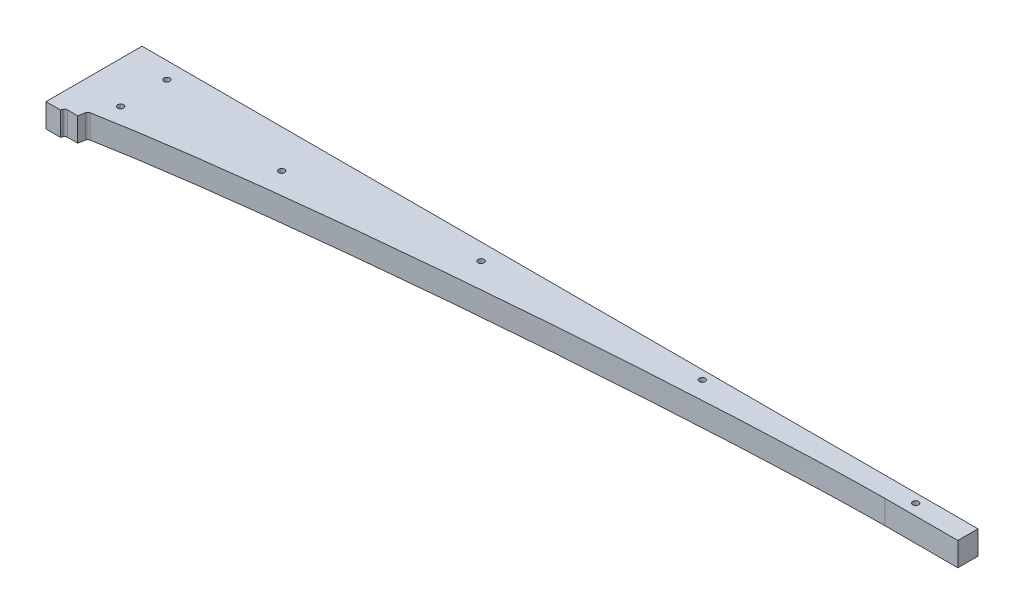
ISO-10303-21;
HEADER;
FILE_DESCRIPTION(('STEP AP214'),'2;1');
FILE_NAME('part.step','',(''),(''),'','','');
FILE_SCHEMA(('AUTOMOTIVE_DESIGN { 1 0 10303 214 1 1 1 1 }'));
ENDSEC;
DATA;
#1=APPLICATION_CONTEXT('core data for automotive mechanical design processes');
#2=APPLICATION_PROTOCOL_DEFINITION('international standard','automotive_design',2000,#1);
#3=PRODUCT_CONTEXT('',#1,'mechanical');
#4=PRODUCT('Part','Part','',(#3));
#5=PRODUCT_RELATED_PRODUCT_CATEGORY('part','',(#4));
#6=PRODUCT_DEFINITION_FORMATION('','',#4);
#7=PRODUCT_DEFINITION_CONTEXT('part definition',#1,'design');
#8=PRODUCT_DEFINITION('design','',#6,#7);
#9=PRODUCT_DEFINITION_SHAPE('','',#8);
#10=(LENGTH_UNIT() NAMED_UNIT(*) SI_UNIT(.MILLI.,.METRE.));
#11=(NAMED_UNIT(*) PLANE_ANGLE_UNIT() SI_UNIT($,.RADIAN.));
#12=(NAMED_UNIT(*) SI_UNIT($,.STERADIAN.) SOLID_ANGLE_UNIT());
#13=UNCERTAINTY_MEASURE_WITH_UNIT(LENGTH_MEASURE(1.E-05),#10,'distance_accuracy_value','');
#14=(GEOMETRIC_REPRESENTATION_CONTEXT(3) GLOBAL_UNCERTAINTY_ASSIGNED_CONTEXT((#13)) GLOBAL_UNIT_ASSIGNED_CONTEXT((#10,
#11,#12)) REPRESENTATION_CONTEXT('',''));
#15=CARTESIAN_POINT('',(0.,0.,0.));
#16=DIRECTION('',(0.,0.,1.));
#17=DIRECTION('',(1.,0.,0.));
#18=AXIS2_PLACEMENT_3D('',#15,#16,#17);
#19=CARTESIAN_POINT('',(444.561943283323,25.4,-59.8731593851156));
#20=DIRECTION('',(0.,1.,0.));
#21=DIRECTION('',(0.,0.,1.));
#22=AXIS2_PLACEMENT_3D('',#19,#20,#21);
#23=PLANE('',#22);
#24=CARTESIAN_POINT('',(402.236708826651,25.4,-85.0899999999993));
#25=DIRECTION('',(0.,1.,0.));
#26=DIRECTION('',(0.,0.,-1.));
#27=AXIS2_PLACEMENT_3D('',#24,#25,#26);
#28=CIRCLE('',#27,3.17499999999997);
#29=CARTESIAN_POINT('',(402.236708826651,25.4,-88.2649999999992));
#30=VERTEX_POINT('',#29);
#31=EDGE_CURVE('E189',#30,#30,#28,.T.);
#32=ORIENTED_EDGE('',*,*,#31,.F.);
#33=EDGE_LOOP('',(#32));
#34=FACE_BOUND('',#33,.T.);
#35=CARTESIAN_POINT('',(211.73670882665,25.4,-61.9759999999993));
#36=DIRECTION('',(0.,1.,0.));
#37=DIRECTION('',(0.,0.,-1.));
#38=AXIS2_PLACEMENT_3D('',#35,#36,#37);
#39=CIRCLE('',#38,3.17499999999997);
#40=CARTESIAN_POINT('',(211.73670882665,25.4,-65.1509999999992));
#41=VERTEX_POINT('',#40);
#42=EDGE_CURVE('E358',#41,#41,#39,.T.);
#43=ORIENTED_EDGE('',*,*,#42,.F.);
#44=EDGE_LOOP('',(#43));
#45=FACE_BOUND('',#44,.T.);
#46=CARTESIAN_POINT('',(859.436708826649,25.4,-93.3449999999753));
#47=DIRECTION('',(0.,1.,0.));
#48=DIRECTION('',(0.,0.,-1.));
#49=AXIS2_PLACEMENT_3D('',#46,#47,#48);
#50=CIRCLE('',#49,3.17500000000008);
#51=CARTESIAN_POINT('',(859.436708826649,25.4,-96.5199999999754));
#52=VERTEX_POINT('',#51);
#53=EDGE_CURVE('E196',#52,#52,#50,.T.);
#54=ORIENTED_EDGE('',*,*,#53,.F.);
#55=EDGE_LOOP('',(#54));
#56=FACE_BOUND('',#55,.T.);
#57=DIRECTION('',(-1.,0.,0.));
#58=VECTOR('',#57,1.);
#59=CARTESIAN_POINT('',(21.2367088266507,25.4,-102.869999999999));
#60=LINE('',#59,#58);
#61=CARTESIAN_POINT('',(916.641442524651,25.4,-102.869999999999));
#62=VERTEX_POINT('',#61);
#63=CARTESIAN_POINT('',(21.2367088266507,25.4,-102.869999999999));
#64=VERTEX_POINT('',#63);
#65=EDGE_CURVE('E134',#62,#64,#60,.T.);
#66=ORIENTED_EDGE('',*,*,#65,.T.);
#67=DIRECTION('',(0.,0.,1.));
#68=VECTOR('',#67,1.);
#69=CARTESIAN_POINT('',(21.2367088266507,25.4,-102.869999999999));
#70=LINE('',#69,#68);
#71=CARTESIAN_POINT('',(21.2367088266507,25.4,0.));
#72=VERTEX_POINT('',#71);
#73=EDGE_CURVE('E121',#64,#72,#70,.T.);
#74=ORIENTED_EDGE('',*,*,#73,.T.);
#75=DIRECTION('',(1.,0.,0.));
#76=VECTOR('',#75,1.);
#77=CARTESIAN_POINT('',(21.2367088266507,25.4,0.));
#78=LINE('',#77,#76);
#79=CARTESIAN_POINT('',(36.6859851988444,25.4,0.));
#80=VERTEX_POINT('',#79);
#81=EDGE_CURVE('E133',#72,#80,#78,.T.);
#82=ORIENTED_EDGE('',*,*,#81,.T.);
#83=DIRECTION('',(0.382683432365092,0.,-0.923879532511286));
#84=VECTOR('',#83,1.);
#85=CARTESIAN_POINT('',(38.2641388714844,25.4,-3.80999999999651));
#86=LINE('',#85,#84);
#87=CARTESIAN_POINT('',(37.4522885311548,25.4,-1.85001989775567));
#88=VERTEX_POINT('',#87);
#89=EDGE_CURVE('E212',#80,#88,#86,.T.);
#90=ORIENTED_EDGE('',*,*,#89,.T.);
#91=CARTESIAN_POINT('',(40.3856060468782,25.4,-0.634999999996506));
#92=DIRECTION('',(0.,1.,0.));
#93=DIRECTION('',(0.,0.,1.));
#94=AXIS2_PLACEMENT_3D('',#91,#92,#93);
#95=CIRCLE('',#94,3.175);
#96=CARTESIAN_POINT('',(40.3856060468782,25.4,-3.80999999999651));
#97=VERTEX_POINT('',#96);
#98=EDGE_CURVE('E173',#88,#97,#95,.F.);
#99=ORIENTED_EDGE('',*,*,#98,.T.);
#100=DIRECTION('',(1.,0.,0.));
#101=VECTOR('',#100,1.);
#102=CARTESIAN_POINT('',(51.3982781943597,25.4,-3.80999999999651));
#103=LINE('',#102,#101);
#104=CARTESIAN_POINT('',(51.3982781943597,25.4,-3.80999999999651));
#105=VERTEX_POINT('',#104);
#106=EDGE_CURVE('E187',#97,#105,#103,.T.);
#107=ORIENTED_EDGE('',*,*,#106,.T.);
#108=DIRECTION('',(0.173648177666957,0.,-0.984807753012203));
#109=VECTOR('',#108,1.);
#110=CARTESIAN_POINT('',(51.3982781943597,25.4,-3.80999999999651));
#111=LINE('',#110,#109);
#112=CARTESIAN_POINT('',(52.6150251906276,25.4,-10.7105151190042));
#113=VERTEX_POINT('',#112);
#114=EDGE_CURVE('E184',#105,#113,#111,.T.);
#115=ORIENTED_EDGE('',*,*,#114,.T.);
#116=CARTESIAN_POINT('',(55.7417898064414,25.4,-10.1591821549116));
#117=DIRECTION('',(0.,1.,0.));
#118=DIRECTION('',(0.,0.,1.));
#119=AXIS2_PLACEMENT_3D('',#116,#117,#118);
#120=CIRCLE('',#119,3.175);
#121=CARTESIAN_POINT('',(55.1596358902719,25.4,-13.280355302606));
#122=VERTEX_POINT('',#121);
#123=EDGE_CURVE('E11',#113,#122,#120,.F.);
#124=ORIENTED_EDGE('',*,*,#123,.T.);
#125=CARTESIAN_POINT('',(52.9966770530499,25.4,-12.8749703877828));
#126=CARTESIAN_POINT('',(53.5035736589583,25.4,-12.9704568957624));
#127=CARTESIAN_POINT('',(54.4996602545379,25.4,-13.1574046114818));
#128=CARTESIAN_POINT('',(56.1011586065889,25.4,-13.4559750271098));
#129=CARTESIAN_POINT('',(57.6634923560854,25.4,-13.7449888849968));
#130=CARTESIAN_POINT('',(59.6839377933843,25.4,-14.1156596660131));
#131=CARTESIAN_POINT('',(62.1534822403393,25.4,-14.5633316950693));
#132=CARTESIAN_POINT('',(65.1705189625762,25.4,-15.1031563872605));
#133=CARTESIAN_POINT('',(68.2310046207992,25.4,-15.6440861263589));
#134=CARTESIAN_POINT('',(72.2883863191581,25.4,-16.3518364741796));
#135=CARTESIAN_POINT('',(79.3245361070449,25.4,-17.5554935214345));
#136=CARTESIAN_POINT('',(89.4923620909571,25.4,-19.2382733442083));
#137=CARTESIAN_POINT('',(105.68333708738,25.4,-21.8092962239965));
#138=CARTESIAN_POINT('',(126.007402707935,25.4,-24.8662978619329));
#139=CARTESIAN_POINT('',(158.541830759677,25.4,-29.4673147987549));
#140=CARTESIAN_POINT('',(199.286173570505,25.4,-34.777983678082));
#141=CARTESIAN_POINT('',(264.569984849046,25.4,-42.5538218512281));
#142=CARTESIAN_POINT('',(346.311852480829,25.4,-51.1621083180932));
#143=CARTESIAN_POINT('',(444.543686217659,25.4,-60.0865242349158));
#144=CARTESIAN_POINT('',(542.885062348474,25.4,-67.7307510529371));
#145=CARTESIAN_POINT('',(624.91099183934,25.4,-73.0340566239148));
#146=CARTESIAN_POINT('',(690.56990049918,25.4,-76.5521620950556));
#147=CARTESIAN_POINT('',(731.621303417314,25.4,-78.4078618379964));
#148=CARTESIAN_POINT('',(764.4690411997,25.4,-79.6424183704648));
#149=CARTESIAN_POINT('',(789.108361631905,25.4,-80.4210826335507));
#150=CARTESIAN_POINT('',(809.638430829978,25.4,-80.9246600475295));
#151=CARTESIAN_POINT('',(826.066348863679,25.4,-81.1946206040518));
#152=CARTESIAN_POINT('',(834.261568502725,25.4,-81.2799999999514));
#153=CARTESIAN_POINT('',(838.361715066886,25.4,-81.2799999999514));
#154=B_SPLINE_CURVE_WITH_KNOTS('',3,(#125,#126,#127,#128,#129,#130,#131,#132,#133,#134,#135,
#136,#137,#138,#139,#140,#141,#142,#143,#144,#145,#146,#147,#148,#149,#150,#151,#152,#153),
.UNSPECIFIED.,.F.,.F.,(4,1,1,1,1,1,1,1,1,1,1,1,1,1,1,1,1,1,1,1,1,1,1,1,1,1,4),
(0.0639967461330328,0.0658248774870112,0.0676530088409897,0.0694811401949681,0.0713092715489465,
0.0749655342569034,0.0786217969648603,0.0822780596728171,0.085934322380774,0.0932468477966877,
0.107871898628515,0.122496949460343,0.151747051123998,0.180997152787653,0.239497356114962,
0.297997559442272,0.414997966096892,0.531998372751512,0.648998779406132,0.765999186060752,
0.824499389388061,0.882999592715371,0.912249694379026,0.941499796042681,0.970749897706336,
0.985374948538164,0.999999999369991),.UNSPECIFIED.);
#155=CARTESIAN_POINT('',(838.361715066886,25.4,-81.2799999999514));
#156=VERTEX_POINT('',#155);
#157=EDGE_CURVE('E186',#122,#156,#154,.T.);
#158=ORIENTED_EDGE('',*,*,#157,.T.);
#159=DIRECTION('',(1.,0.,0.));
#160=VECTOR('',#159,1.);
#161=CARTESIAN_POINT('',(838.361715066886,25.4,-81.2799999999514));
#162=LINE('',#161,#160);
#163=CARTESIAN_POINT('',(916.641442524651,25.4,-81.2799999999513));
#164=VERTEX_POINT('',#163);
#165=EDGE_CURVE('E223',#156,#164,#162,.T.);
#166=ORIENTED_EDGE('',*,*,#165,.T.);
#167=DIRECTION('',(0.,0.,-1.));
#168=VECTOR('',#167,1.);
#169=CARTESIAN_POINT('',(916.641442524651,25.4,-83.8199999999514));
#170=LINE('',#169,#168);
#171=EDGE_CURVE('E139',#164,#62,#170,.T.);
#172=ORIENTED_EDGE('',*,*,#171,.T.);
#173=EDGE_LOOP('',(#66,#74,#82,#90,#99,#107,#115,#124,#158,#166,#172));
#174=FACE_BOUND('',#173,.T.);
#175=CARTESIAN_POINT('',(65.6867088266506,25.4,-85.0899999999993));
#176=DIRECTION('',(0.,1.,0.));
#177=DIRECTION('',(0.,0.,-1.));
#178=AXIS2_PLACEMENT_3D('',#175,#176,#177);
#179=CIRCLE('',#178,3.175);
#180=CARTESIAN_POINT('',(65.6867088266506,25.4,-88.2649999999992));
#181=VERTEX_POINT('',#180);
#182=EDGE_CURVE('E197',#181,#181,#179,.T.);
#183=ORIENTED_EDGE('',*,*,#182,.F.);
#184=EDGE_LOOP('',(#183));
#185=FACE_BOUND('',#184,.T.);
#186=CARTESIAN_POINT('',(630.836708826651,25.4,-93.3449999999992));
#187=DIRECTION('',(0.,1.,0.));
#188=DIRECTION('',(0.,0.,-1.));
#189=AXIS2_PLACEMENT_3D('',#186,#187,#188);
#190=CIRCLE('',#189,3.17500000000008);
#191=CARTESIAN_POINT('',(630.836708826651,25.4,-96.5199999999993));
#192=VERTEX_POINT('',#191);
#193=EDGE_CURVE('E178',#192,#192,#190,.T.);
#194=ORIENTED_EDGE('',*,*,#193,.F.);
#195=EDGE_LOOP('',(#194));
#196=FACE_BOUND('',#195,.T.);
#197=CARTESIAN_POINT('',(65.6867088266496,25.4,-35.5599999999992));
#198=DIRECTION('',(0.,1.,0.));
#199=DIRECTION('',(0.,0.,-1.));
#200=AXIS2_PLACEMENT_3D('',#197,#198,#199);
#201=CIRCLE('',#200,3.175);
#202=CARTESIAN_POINT('',(65.6867088266496,25.4,-38.7349999999992));
#203=VERTEX_POINT('',#202);
#204=EDGE_CURVE('E361',#203,#203,#201,.T.);
#205=ORIENTED_EDGE('',*,*,#204,.F.);
#206=EDGE_LOOP('',(#205));
#207=FACE_BOUND('',#206,.T.);
#208=ADVANCED_FACE('F37',(#34,#45,#56,#174,#185,#196,#207),#23,.T.);
#209=CARTESIAN_POINT('',(444.561943283323,0.,-59.8731593851156));
#210=DIRECTION('',(0.,1.,0.));
#211=DIRECTION('',(0.,0.,1.));
#212=AXIS2_PLACEMENT_3D('',#209,#210,#211);
#213=PLANE('',#212);
#214=DIRECTION('',(-1.,0.,0.));
#215=VECTOR('',#214,1.);
#216=CARTESIAN_POINT('',(21.2367088266507,0.,-102.869999999999));
#217=LINE('',#216,#215);
#218=CARTESIAN_POINT('',(916.641442524651,0.,-102.869999999999));
#219=VERTEX_POINT('',#218);
#220=CARTESIAN_POINT('',(21.2367088266507,0.,-102.869999999999));
#221=VERTEX_POINT('',#220);
#222=EDGE_CURVE('E148',#219,#221,#217,.T.);
#223=ORIENTED_EDGE('',*,*,#222,.F.);
#224=DIRECTION('',(0.,0.,-1.));
#225=VECTOR('',#224,1.);
#226=CARTESIAN_POINT('',(916.641442524651,0.,-102.869999999999));
#227=LINE('',#226,#225);
#228=CARTESIAN_POINT('',(916.641442524651,0.,-81.2799999999513));
#229=VERTEX_POINT('',#228);
#230=EDGE_CURVE('E144',#229,#219,#227,.T.);
#231=ORIENTED_EDGE('',*,*,#230,.F.);
#232=DIRECTION('',(1.,0.,0.));
#233=VECTOR('',#232,1.);
#234=CARTESIAN_POINT('',(916.641442524651,0.,-81.2799999999513));
#235=LINE('',#234,#233);
#236=CARTESIAN_POINT('',(838.361715066886,0.,-81.2799999999514));
#237=VERTEX_POINT('',#236);
#238=EDGE_CURVE('E297',#237,#229,#235,.T.);
#239=ORIENTED_EDGE('',*,*,#238,.F.);
#240=CARTESIAN_POINT('',(52.9966770530499,0.,-12.8749703877828));
#241=CARTESIAN_POINT('',(53.5035736589583,0.,-12.9704568957624));
#242=CARTESIAN_POINT('',(54.4996602545379,0.,-13.1574046114818));
#243=CARTESIAN_POINT('',(56.1011586065889,0.,-13.4559750271098));
#244=CARTESIAN_POINT('',(57.6634923560854,0.,-13.7449888849968));
#245=CARTESIAN_POINT('',(59.6839377933843,0.,-14.1156596660131));
#246=CARTESIAN_POINT('',(62.1534822403393,0.,-14.5633316950693));
#247=CARTESIAN_POINT('',(65.1705189625762,0.,-15.1031563872605));
#248=CARTESIAN_POINT('',(68.2310046207992,0.,-15.6440861263589));
#249=CARTESIAN_POINT('',(72.2883863191581,0.,-16.3518364741796));
#250=CARTESIAN_POINT('',(79.3245361070449,0.,-17.5554935214345));
#251=CARTESIAN_POINT('',(89.4923620909571,0.,-19.2382733442083));
#252=CARTESIAN_POINT('',(105.68333708738,0.,-21.8092962239965));
#253=CARTESIAN_POINT('',(126.007402707935,0.,-24.8662978619329));
#254=CARTESIAN_POINT('',(158.541830759677,0.,-29.4673147987549));
#255=CARTESIAN_POINT('',(199.286173570505,0.,-34.777983678082));
#256=CARTESIAN_POINT('',(264.569984849046,0.,-42.5538218512281));
#257=CARTESIAN_POINT('',(346.311852480829,0.,-51.1621083180932));
#258=CARTESIAN_POINT('',(444.543686217659,0.,-60.0865242349158));
#259=CARTESIAN_POINT('',(542.885062348474,0.,-67.7307510529371));
#260=CARTESIAN_POINT('',(624.91099183934,0.,-73.0340566239148));
#261=CARTESIAN_POINT('',(690.56990049918,0.,-76.5521620950556));
#262=CARTESIAN_POINT('',(731.621303417314,0.,-78.4078618379964));
#263=CARTESIAN_POINT('',(764.4690411997,0.,-79.6424183704648));
#264=CARTESIAN_POINT('',(789.108361631905,0.,-80.4210826335507));
#265=CARTESIAN_POINT('',(809.638430829978,0.,-80.9246600475295));
#266=CARTESIAN_POINT('',(826.066348863679,0.,-81.1946206040518));
#267=CARTESIAN_POINT('',(834.261568502725,0.,-81.2799999999514));
#268=CARTESIAN_POINT('',(838.361715066886,0.,-81.2799999999514));
#269=B_SPLINE_CURVE_WITH_KNOTS('',3,(#240,#241,#242,#243,#244,#245,#246,#247,#248,#249,#250,
#251,#252,#253,#254,#255,#256,#257,#258,#259,#260,#261,#262,#263,#264,#265,#266,#267,#268),
.UNSPECIFIED.,.F.,.F.,(4,1,1,1,1,1,1,1,1,1,1,1,1,1,1,1,1,1,1,1,1,1,1,1,1,1,4),
(0.0639967461330328,0.0658248774870112,0.0676530088409897,0.0694811401949681,0.0713092715489465,
0.0749655342569034,0.0786217969648603,0.0822780596728171,0.085934322380774,0.0932468477966877,
0.107871898628515,0.122496949460343,0.151747051123998,0.180997152787653,0.239497356114962,
0.297997559442272,0.414997966096892,0.531998372751512,0.648998779406132,0.765999186060752,
0.824499389388061,0.882999592715371,0.912249694379026,0.941499796042681,0.970749897706336,
0.985374948538164,0.999999999369991),.UNSPECIFIED.);
#270=CARTESIAN_POINT('',(55.1596358902719,0.,-13.280355302606));
#271=VERTEX_POINT('',#270);
#272=EDGE_CURVE('E320',#271,#237,#269,.T.);
#273=ORIENTED_EDGE('',*,*,#272,.F.);
#274=CARTESIAN_POINT('',(55.7417898064414,0.,-10.1591821549116));
#275=DIRECTION('',(0.,1.,0.));
#276=DIRECTION('',(0.,0.,1.));
#277=AXIS2_PLACEMENT_3D('',#274,#275,#276);
#278=CIRCLE('',#277,3.175);
#279=CARTESIAN_POINT('',(52.6150251906276,0.,-10.7105151190042));
#280=VERTEX_POINT('',#279);
#281=EDGE_CURVE('E46',#271,#280,#278,.T.);
#282=ORIENTED_EDGE('',*,*,#281,.T.);
#283=DIRECTION('',(0.173648177666957,0.,-0.984807753012203));
#284=VECTOR('',#283,1.);
#285=CARTESIAN_POINT('',(51.3982781943597,0.,-3.80999999999651));
#286=LINE('',#285,#284);
#287=CARTESIAN_POINT('',(51.3982781943597,0.,-3.80999999999651));
#288=VERTEX_POINT('',#287);
#289=EDGE_CURVE('E317',#288,#280,#286,.T.);
#290=ORIENTED_EDGE('',*,*,#289,.F.);
#291=DIRECTION('',(1.,0.,0.));
#292=VECTOR('',#291,1.);
#293=CARTESIAN_POINT('',(51.3982781943597,0.,-3.80999999999651));
#294=LINE('',#293,#292);
#295=CARTESIAN_POINT('',(40.3856060468782,0.,-3.80999999999651));
#296=VERTEX_POINT('',#295);
#297=EDGE_CURVE('E315',#296,#288,#294,.T.);
#298=ORIENTED_EDGE('',*,*,#297,.F.);
#299=CARTESIAN_POINT('',(40.3856060468782,0.,-0.634999999996506));
#300=DIRECTION('',(0.,1.,0.));
#301=DIRECTION('',(0.,0.,1.));
#302=AXIS2_PLACEMENT_3D('',#299,#300,#301);
#303=CIRCLE('',#302,3.175);
#304=CARTESIAN_POINT('',(37.4522885311548,0.,-1.85001989775567));
#305=VERTEX_POINT('',#304);
#306=EDGE_CURVE('E170',#296,#305,#303,.T.);
#307=ORIENTED_EDGE('',*,*,#306,.T.);
#308=DIRECTION('',(0.382683432365092,0.,-0.923879532511286));
#309=VECTOR('',#308,1.);
#310=CARTESIAN_POINT('',(38.2641388714844,0.,-3.80999999999651));
#311=LINE('',#310,#309);
#312=CARTESIAN_POINT('',(36.6859851988444,0.,0.));
#313=VERTEX_POINT('',#312);
#314=EDGE_CURVE('E311',#313,#305,#311,.T.);
#315=ORIENTED_EDGE('',*,*,#314,.F.);
#316=DIRECTION('',(1.,0.,0.));
#317=VECTOR('',#316,1.);
#318=CARTESIAN_POINT('',(33.9367090101017,0.,0.));
#319=LINE('',#318,#317);
#320=CARTESIAN_POINT('',(21.2367088266507,0.,0.));
#321=VERTEX_POINT('',#320);
#322=EDGE_CURVE('E306',#321,#313,#319,.T.);
#323=ORIENTED_EDGE('',*,*,#322,.F.);
#324=DIRECTION('',(0.,0.,1.));
#325=VECTOR('',#324,1.);
#326=CARTESIAN_POINT('',(21.2367088266507,0.,-102.869999999999));
#327=LINE('',#326,#325);
#328=EDGE_CURVE('E301',#221,#321,#327,.T.);
#329=ORIENTED_EDGE('',*,*,#328,.F.);
#330=EDGE_LOOP('',(#223,#231,#239,#273,#282,#290,#298,#307,#315,#323,#329));
#331=FACE_BOUND('',#330,.T.);
#332=CARTESIAN_POINT('',(859.436708826649,0.,-93.3449999999753));
#333=DIRECTION('',(0.,1.,0.));
#334=DIRECTION('',(0.,0.,-1.));
#335=AXIS2_PLACEMENT_3D('',#332,#333,#334);
#336=CIRCLE('',#335,3.17500000000008);
#337=CARTESIAN_POINT('',(859.436708826649,0.,-96.5199999999754));
#338=VERTEX_POINT('',#337);
#339=EDGE_CURVE('E194',#338,#338,#336,.T.);
#340=ORIENTED_EDGE('',*,*,#339,.T.);
#341=EDGE_LOOP('',(#340));
#342=FACE_BOUND('',#341,.T.);
#343=CARTESIAN_POINT('',(65.6867088266506,0.,-85.0899999999993));
#344=DIRECTION('',(0.,1.,0.));
#345=DIRECTION('',(0.,0.,-1.));
#346=AXIS2_PLACEMENT_3D('',#343,#344,#345);
#347=CIRCLE('',#346,3.175);
#348=CARTESIAN_POINT('',(65.6867088266506,0.,-88.2649999999992));
#349=VERTEX_POINT('',#348);
#350=EDGE_CURVE('E206',#349,#349,#347,.T.);
#351=ORIENTED_EDGE('',*,*,#350,.T.);
#352=EDGE_LOOP('',(#351));
#353=FACE_BOUND('',#352,.T.);
#354=CARTESIAN_POINT('',(211.73670882665,0.,-61.9759999999993));
#355=DIRECTION('',(0.,1.,0.));
#356=DIRECTION('',(0.,0.,-1.));
#357=AXIS2_PLACEMENT_3D('',#354,#355,#356);
#358=CIRCLE('',#357,3.17499999999997);
#359=CARTESIAN_POINT('',(211.73670882665,0.,-65.1509999999992));
#360=VERTEX_POINT('',#359);
#361=EDGE_CURVE('E181',#360,#360,#358,.T.);
#362=ORIENTED_EDGE('',*,*,#361,.T.);
#363=EDGE_LOOP('',(#362));
#364=FACE_BOUND('',#363,.T.);
#365=CARTESIAN_POINT('',(630.836708826651,0.,-93.3449999999992));
#366=DIRECTION('',(0.,1.,0.));
#367=DIRECTION('',(0.,0.,-1.));
#368=AXIS2_PLACEMENT_3D('',#365,#366,#367);
#369=CIRCLE('',#368,3.17500000000008);
#370=CARTESIAN_POINT('',(630.836708826651,0.,-96.5199999999993));
#371=VERTEX_POINT('',#370);
#372=EDGE_CURVE('E182',#371,#371,#369,.T.);
#373=ORIENTED_EDGE('',*,*,#372,.T.);
#374=EDGE_LOOP('',(#373));
#375=FACE_BOUND('',#374,.T.);
#376=CARTESIAN_POINT('',(402.236708826651,0.,-85.0899999999993));
#377=DIRECTION('',(0.,1.,0.));
#378=DIRECTION('',(0.,0.,-1.));
#379=AXIS2_PLACEMENT_3D('',#376,#377,#378);
#380=CIRCLE('',#379,3.17499999999997);
#381=CARTESIAN_POINT('',(402.236708826651,0.,-88.2649999999992));
#382=VERTEX_POINT('',#381);
#383=EDGE_CURVE('E192',#382,#382,#380,.T.);
#384=ORIENTED_EDGE('',*,*,#383,.T.);
#385=EDGE_LOOP('',(#384));
#386=FACE_BOUND('',#385,.T.);
#387=CARTESIAN_POINT('',(65.6867088266496,0.,-35.5599999999992));
#388=DIRECTION('',(0.,1.,0.));
#389=DIRECTION('',(0.,0.,-1.));
#390=AXIS2_PLACEMENT_3D('',#387,#388,#389);
#391=CIRCLE('',#390,3.175);
#392=CARTESIAN_POINT('',(65.6867088266496,0.,-38.7349999999992));
#393=VERTEX_POINT('',#392);
#394=EDGE_CURVE('E359',#393,#393,#391,.T.);
#395=ORIENTED_EDGE('',*,*,#394,.T.);
#396=EDGE_LOOP('',(#395));
#397=FACE_BOUND('',#396,.T.);
#398=ADVANCED_FACE('F254',(#331,#342,#353,#364,#375,#386,#397),#213,.F.);
#399=CARTESIAN_POINT('',(21.2367088266507,25.4,-102.869999999999));
#400=DIRECTION('',(0.,0.,1.));
#401=DIRECTION('',(1.,0.,0.));
#402=AXIS2_PLACEMENT_3D('',#399,#400,#401);
#403=PLANE('',#402);
#404=ORIENTED_EDGE('',*,*,#222,.T.);
#405=DIRECTION('',(0.,-1.,0.));
#406=VECTOR('',#405,1.);
#407=CARTESIAN_POINT('',(21.2367088266507,25.4,-102.869999999999));
#408=LINE('',#407,#406);
#409=EDGE_CURVE('E126',#64,#221,#408,.T.);
#410=ORIENTED_EDGE('',*,*,#409,.F.);
#411=ORIENTED_EDGE('',*,*,#65,.F.);
#412=DIRECTION('',(0.,-1.,0.));
#413=VECTOR('',#412,1.);
#414=CARTESIAN_POINT('',(916.641442524651,25.4,-102.869999999999));
#415=LINE('',#414,#413);
#416=EDGE_CURVE('E291',#62,#219,#415,.T.);
#417=ORIENTED_EDGE('',*,*,#416,.T.);
#418=EDGE_LOOP('',(#404,#410,#411,#417));
#419=FACE_BOUND('',#418,.T.);
#420=ADVANCED_FACE('F146',(#419),#403,.F.);
#421=CARTESIAN_POINT('',(21.2367088266507,25.4,-102.869999999999));
#422=DIRECTION('',(1.,0.,0.));
#423=DIRECTION('',(0.,0.,-1.));
#424=AXIS2_PLACEMENT_3D('',#421,#422,#423);
#425=PLANE('',#424);
#426=ORIENTED_EDGE('',*,*,#328,.T.);
#427=DIRECTION('',(0.,-1.,0.));
#428=VECTOR('',#427,1.);
#429=CARTESIAN_POINT('',(21.2367088266507,25.4,0.));
#430=LINE('',#429,#428);
#431=EDGE_CURVE('E129',#72,#321,#430,.T.);
#432=ORIENTED_EDGE('',*,*,#431,.F.);
#433=ORIENTED_EDGE('',*,*,#73,.F.);
#434=ORIENTED_EDGE('',*,*,#409,.T.);
#435=EDGE_LOOP('',(#426,#432,#433,#434));
#436=FACE_BOUND('',#435,.T.);
#437=ADVANCED_FACE('F124',(#436),#425,.F.);
#438=CARTESIAN_POINT('',(33.9367090101017,25.4,0.));
#439=DIRECTION('',(0.,0.,-1.));
#440=DIRECTION('',(-1.,0.,0.));
#441=AXIS2_PLACEMENT_3D('',#438,#439,#440);
#442=PLANE('',#441);
#443=ORIENTED_EDGE('',*,*,#322,.T.);
#444=DIRECTION('',(0.,-1.,0.));
#445=VECTOR('',#444,1.);
#446=CARTESIAN_POINT('',(36.6859851988444,25.4,0.));
#447=LINE('',#446,#445);
#448=EDGE_CURVE('E158',#80,#313,#447,.T.);
#449=ORIENTED_EDGE('',*,*,#448,.F.);
#450=ORIENTED_EDGE('',*,*,#81,.F.);
#451=ORIENTED_EDGE('',*,*,#431,.T.);
#452=EDGE_LOOP('',(#443,#449,#450,#451));
#453=FACE_BOUND('',#452,.T.);
#454=ADVANCED_FACE('F246',(#453),#442,.F.);
#455=CARTESIAN_POINT('',(38.2641388714844,25.4,-3.80999999999651));
#456=DIRECTION('',(-0.923879532511286,0.,-0.382683432365092));
#457=DIRECTION('',(-0.382683432365092,0.,0.923879532511286));
#458=AXIS2_PLACEMENT_3D('',#455,#456,#457);
#459=PLANE('',#458);
#460=ORIENTED_EDGE('',*,*,#314,.T.);
#461=DIRECTION('',(0.,-1.,0.));
#462=VECTOR('',#461,1.);
#463=CARTESIAN_POINT('',(37.4522885311548,25.4,-1.85001989775567));
#464=LINE('',#463,#462);
#465=EDGE_CURVE('E155',#305,#88,#464,.F.);
#466=ORIENTED_EDGE('',*,*,#465,.T.);
#467=ORIENTED_EDGE('',*,*,#89,.F.);
#468=ORIENTED_EDGE('',*,*,#448,.T.);
#469=EDGE_LOOP('',(#460,#466,#467,#468));
#470=FACE_BOUND('',#469,.T.);
#471=ADVANCED_FACE('F242',(#470),#459,.F.);
#472=CARTESIAN_POINT('',(51.3982781943597,25.4,-3.80999999999651));
#473=DIRECTION('',(0.,0.,-1.));
#474=DIRECTION('',(-1.,0.,0.));
#475=AXIS2_PLACEMENT_3D('',#472,#473,#474);
#476=PLANE('',#475);
#477=ORIENTED_EDGE('',*,*,#106,.F.);
#478=DIRECTION('',(0.,-1.,0.));
#479=VECTOR('',#478,1.);
#480=CARTESIAN_POINT('',(40.3856060468782,0.,-3.80999999999651));
#481=LINE('',#480,#479);
#482=EDGE_CURVE('E150',#97,#296,#481,.T.);
#483=ORIENTED_EDGE('',*,*,#482,.T.);
#484=ORIENTED_EDGE('',*,*,#297,.T.);
#485=DIRECTION('',(0.,-1.,0.));
#486=VECTOR('',#485,1.);
#487=CARTESIAN_POINT('',(51.3982781943597,25.4,-3.80999999999651));
#488=LINE('',#487,#486);
#489=EDGE_CURVE('E336',#105,#288,#488,.T.);
#490=ORIENTED_EDGE('',*,*,#489,.F.);
#491=EDGE_LOOP('',(#477,#483,#484,#490));
#492=FACE_BOUND('',#491,.T.);
#493=ADVANCED_FACE('F239',(#492),#476,.F.);
#494=CARTESIAN_POINT('',(51.3982781943597,25.4,-3.80999999999651));
#495=DIRECTION('',(-0.984807753012203,0.,-0.173648177666957));
#496=DIRECTION('',(-0.173648177666957,0.,0.984807753012203));
#497=AXIS2_PLACEMENT_3D('',#494,#495,#496);
#498=PLANE('',#497);
#499=ORIENTED_EDGE('',*,*,#289,.T.);
#500=DIRECTION('',(0.,1.,0.));
#501=VECTOR('',#500,1.);
#502=CARTESIAN_POINT('',(52.6150251906276,25.4,-10.7105151190042));
#503=LINE('',#502,#501);
#504=EDGE_CURVE('E53',#280,#113,#503,.T.);
#505=ORIENTED_EDGE('',*,*,#504,.T.);
#506=ORIENTED_EDGE('',*,*,#114,.F.);
#507=ORIENTED_EDGE('',*,*,#489,.T.);
#508=EDGE_LOOP('',(#499,#505,#506,#507));
#509=FACE_BOUND('',#508,.T.);
#510=ADVANCED_FACE('F234',(#509),#498,.F.);
#511=DIRECTION('',(0.,-1.,0.));
#512=VECTOR('',#511,1.);
#513=SURFACE_OF_LINEAR_EXTRUSION('',#154,#512);
#514=ORIENTED_EDGE('',*,*,#157,.F.);
#515=DIRECTION('',(0.,-1.,0.));
#516=VECTOR('',#515,1.);
#517=CARTESIAN_POINT('',(55.1596358902719,25.4,-13.280355302606));
#518=LINE('',#517,#516);
#519=EDGE_CURVE('E164',#122,#271,#518,.T.);
#520=ORIENTED_EDGE('',*,*,#519,.T.);
#521=ORIENTED_EDGE('',*,*,#272,.T.);
#522=DIRECTION('',(0.,-1.,0.));
#523=VECTOR('',#522,1.);
#524=CARTESIAN_POINT('',(838.361715066886,25.4,-81.2799999999514));
#525=LINE('',#524,#523);
#526=EDGE_CURVE('E332',#156,#237,#525,.T.);
#527=ORIENTED_EDGE('',*,*,#526,.F.);
#528=EDGE_LOOP('',(#514,#520,#521,#527));
#529=FACE_BOUND('',#528,.T.);
#530=ADVANCED_FACE('F229',(#529),#513,.F.);
#531=CARTESIAN_POINT('',(916.641442524651,25.4,-81.2799999999513));
#532=DIRECTION('',(0.,0.,-1.));
#533=DIRECTION('',(-1.,0.,0.));
#534=AXIS2_PLACEMENT_3D('',#531,#532,#533);
#535=PLANE('',#534);
#536=ORIENTED_EDGE('',*,*,#238,.T.);
#537=DIRECTION('',(0.,-1.,0.));
#538=VECTOR('',#537,1.);
#539=CARTESIAN_POINT('',(916.641442524651,25.4,-81.2799999999513));
#540=LINE('',#539,#538);
#541=EDGE_CURVE('E293',#164,#229,#540,.T.);
#542=ORIENTED_EDGE('',*,*,#541,.F.);
#543=ORIENTED_EDGE('',*,*,#165,.F.);
#544=ORIENTED_EDGE('',*,*,#526,.T.);
#545=EDGE_LOOP('',(#536,#542,#543,#544));
#546=FACE_BOUND('',#545,.T.);
#547=ADVANCED_FACE('F233',(#546),#535,.F.);
#548=CARTESIAN_POINT('',(916.641442524651,25.4,-102.869999999999));
#549=DIRECTION('',(-1.,0.,0.));
#550=DIRECTION('',(0.,0.,1.));
#551=AXIS2_PLACEMENT_3D('',#548,#549,#550);
#552=PLANE('',#551);
#553=ORIENTED_EDGE('',*,*,#230,.T.);
#554=ORIENTED_EDGE('',*,*,#416,.F.);
#555=ORIENTED_EDGE('',*,*,#171,.F.);
#556=ORIENTED_EDGE('',*,*,#541,.T.);
#557=EDGE_LOOP('',(#553,#554,#555,#556));
#558=FACE_BOUND('',#557,.T.);
#559=ADVANCED_FACE('F280',(#558),#552,.F.);
#560=CARTESIAN_POINT('',(859.436708826649,25.4,-93.3449999999753));
#561=DIRECTION('',(0.,-1.,0.));
#562=DIRECTION('',(0.,0.,-1.));
#563=AXIS2_PLACEMENT_3D('',#560,#561,#562);
#564=CYLINDRICAL_SURFACE('',#563,3.17500000000008);
#565=ORIENTED_EDGE('',*,*,#53,.T.);
#566=EDGE_LOOP('',(#565));
#567=FACE_BOUND('',#566,.T.);
#568=ORIENTED_EDGE('',*,*,#339,.F.);
#569=EDGE_LOOP('',(#568));
#570=FACE_BOUND('',#569,.T.);
#571=ADVANCED_FACE('F278',(#567,#570),#564,.F.);
#572=CARTESIAN_POINT('',(65.6867088266506,25.4,-85.0899999999993));
#573=DIRECTION('',(0.,-1.,0.));
#574=DIRECTION('',(0.,0.,-1.));
#575=AXIS2_PLACEMENT_3D('',#572,#573,#574);
#576=CYLINDRICAL_SURFACE('',#575,3.175);
#577=ORIENTED_EDGE('',*,*,#182,.T.);
#578=EDGE_LOOP('',(#577));
#579=FACE_BOUND('',#578,.T.);
#580=ORIENTED_EDGE('',*,*,#350,.F.);
#581=EDGE_LOOP('',(#580));
#582=FACE_BOUND('',#581,.T.);
#583=ADVANCED_FACE('F287',(#579,#582),#576,.F.);
#584=CARTESIAN_POINT('',(211.73670882665,25.4,-61.9759999999993));
#585=DIRECTION('',(0.,-1.,0.));
#586=DIRECTION('',(0.,0.,-1.));
#587=AXIS2_PLACEMENT_3D('',#584,#585,#586);
#588=CYLINDRICAL_SURFACE('',#587,3.17499999999997);
#589=ORIENTED_EDGE('',*,*,#42,.T.);
#590=EDGE_LOOP('',(#589));
#591=FACE_BOUND('',#590,.T.);
#592=ORIENTED_EDGE('',*,*,#361,.F.);
#593=EDGE_LOOP('',(#592));
#594=FACE_BOUND('',#593,.T.);
#595=ADVANCED_FACE('F383',(#591,#594),#588,.F.);
#596=CARTESIAN_POINT('',(630.836708826651,25.4,-93.3449999999992));
#597=DIRECTION('',(0.,-1.,0.));
#598=DIRECTION('',(0.,0.,-1.));
#599=AXIS2_PLACEMENT_3D('',#596,#597,#598);
#600=CYLINDRICAL_SURFACE('',#599,3.17500000000008);
#601=ORIENTED_EDGE('',*,*,#193,.T.);
#602=EDGE_LOOP('',(#601));
#603=FACE_BOUND('',#602,.T.);
#604=ORIENTED_EDGE('',*,*,#372,.F.);
#605=EDGE_LOOP('',(#604));
#606=FACE_BOUND('',#605,.T.);
#607=ADVANCED_FACE('F385',(#603,#606),#600,.F.);
#608=CARTESIAN_POINT('',(402.236708826651,25.4,-85.0899999999993));
#609=DIRECTION('',(0.,-1.,0.));
#610=DIRECTION('',(0.,0.,-1.));
#611=AXIS2_PLACEMENT_3D('',#608,#609,#610);
#612=CYLINDRICAL_SURFACE('',#611,3.17499999999997);
#613=ORIENTED_EDGE('',*,*,#31,.T.);
#614=EDGE_LOOP('',(#613));
#615=FACE_BOUND('',#614,.T.);
#616=ORIENTED_EDGE('',*,*,#383,.F.);
#617=EDGE_LOOP('',(#616));
#618=FACE_BOUND('',#617,.T.);
#619=ADVANCED_FACE('F264',(#615,#618),#612,.F.);
#620=CARTESIAN_POINT('',(65.6867088266496,25.4,-35.5599999999992));
#621=DIRECTION('',(0.,-1.,0.));
#622=DIRECTION('',(0.,0.,-1.));
#623=AXIS2_PLACEMENT_3D('',#620,#621,#622);
#624=CYLINDRICAL_SURFACE('',#623,3.175);
#625=ORIENTED_EDGE('',*,*,#204,.T.);
#626=EDGE_LOOP('',(#625));
#627=FACE_BOUND('',#626,.T.);
#628=ORIENTED_EDGE('',*,*,#394,.F.);
#629=EDGE_LOOP('',(#628));
#630=FACE_BOUND('',#629,.T.);
#631=ADVANCED_FACE('F257',(#627,#630),#624,.F.);
#632=CARTESIAN_POINT('',(40.3856060468782,25.4,-0.634999999996506));
#633=DIRECTION('',(0.,1.,0.));
#634=DIRECTION('',(0.,0.,1.));
#635=AXIS2_PLACEMENT_3D('',#632,#633,#634);
#636=CYLINDRICAL_SURFACE('',#635,3.175);
#637=ORIENTED_EDGE('',*,*,#98,.F.);
#638=ORIENTED_EDGE('',*,*,#465,.F.);
#639=ORIENTED_EDGE('',*,*,#306,.F.);
#640=ORIENTED_EDGE('',*,*,#482,.F.);
#641=EDGE_LOOP('',(#637,#638,#639,#640));
#642=FACE_BOUND('',#641,.T.);
#643=ADVANCED_FACE('F255',(#642),#636,.F.);
#644=CARTESIAN_POINT('',(55.7417898064414,12.7,-10.1591821549116));
#645=DIRECTION('',(0.,-1.,0.));
#646=DIRECTION('',(0.,0.,-1.));
#647=AXIS2_PLACEMENT_3D('',#644,#645,#646);
#648=CYLINDRICAL_SURFACE('',#647,3.175);
#649=ORIENTED_EDGE('',*,*,#123,.F.);
#650=ORIENTED_EDGE('',*,*,#504,.F.);
#651=ORIENTED_EDGE('',*,*,#281,.F.);
#652=ORIENTED_EDGE('',*,*,#519,.F.);
#653=EDGE_LOOP('',(#649,#650,#651,#652));
#654=FACE_BOUND('',#653,.T.);
#655=ADVANCED_FACE('F39',(#654),#648,.F.);
#656=CLOSED_SHELL('',(#208,#398,#420,#437,#454,#471,#493,#510,#530,#547,#559,#571,#583,#595,
#607,#619,#631,#643,#655));
#657=MANIFOLD_SOLID_BREP('B2',#656);
#658=ADVANCED_BREP_SHAPE_REPRESENTATION('',(#18,#657),#14);
#659=SHAPE_DEFINITION_REPRESENTATION(#9,#658);
ENDSEC;
END-ISO-10303-21;
